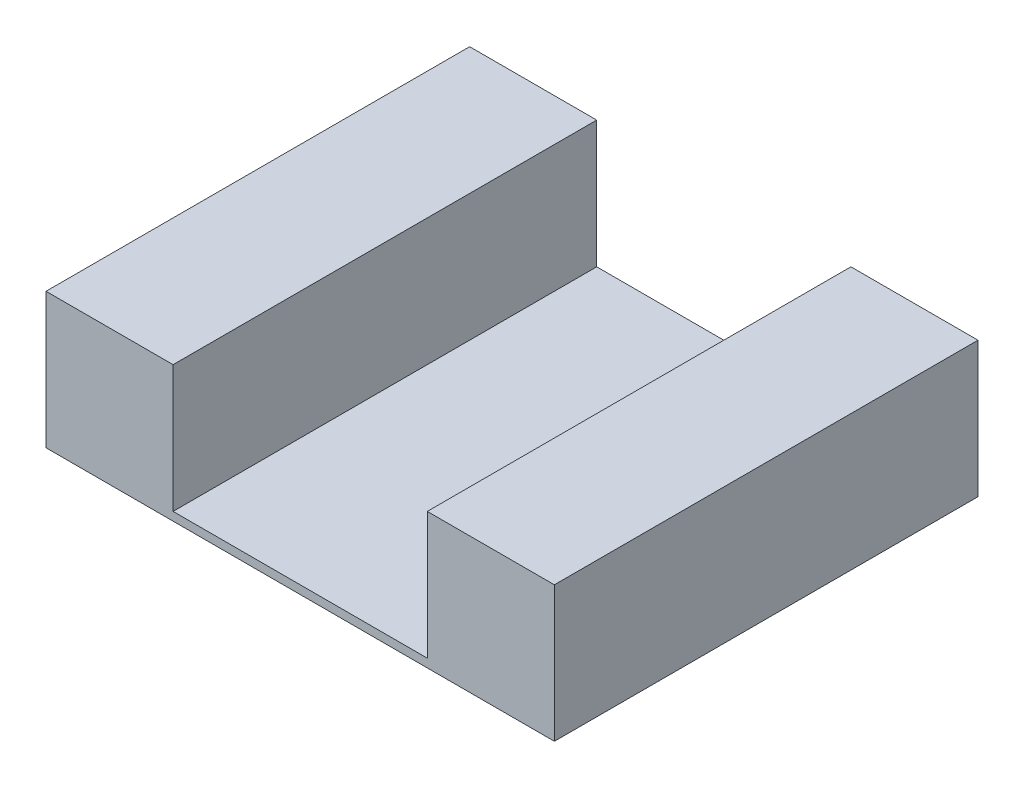
ISO-10303-21;
HEADER;
FILE_DESCRIPTION(('STEP AP214'),'2;1');
FILE_NAME('part.step','',(''),(''),'','','');
FILE_SCHEMA(('AUTOMOTIVE_DESIGN { 1 0 10303 214 1 1 1 1 }'));
ENDSEC;
DATA;
#1=APPLICATION_CONTEXT('core data for automotive mechanical design processes');
#2=APPLICATION_PROTOCOL_DEFINITION('international standard','automotive_design',2000,#1);
#3=PRODUCT_CONTEXT('',#1,'mechanical');
#4=PRODUCT('Part','Part','',(#3));
#5=PRODUCT_RELATED_PRODUCT_CATEGORY('part','',(#4));
#6=PRODUCT_DEFINITION_FORMATION('','',#4);
#7=PRODUCT_DEFINITION_CONTEXT('part definition',#1,'design');
#8=PRODUCT_DEFINITION('design','',#6,#7);
#9=PRODUCT_DEFINITION_SHAPE('','',#8);
#10=(LENGTH_UNIT() NAMED_UNIT(*) SI_UNIT(.MILLI.,.METRE.));
#11=(NAMED_UNIT(*) PLANE_ANGLE_UNIT() SI_UNIT($,.RADIAN.));
#12=(NAMED_UNIT(*) SI_UNIT($,.STERADIAN.) SOLID_ANGLE_UNIT());
#13=UNCERTAINTY_MEASURE_WITH_UNIT(LENGTH_MEASURE(1.E-05),#10,'distance_accuracy_value','');
#14=(GEOMETRIC_REPRESENTATION_CONTEXT(3) GLOBAL_UNCERTAINTY_ASSIGNED_CONTEXT((#13)) GLOBAL_UNIT_ASSIGNED_CONTEXT((#10,
#11,#12)) REPRESENTATION_CONTEXT('',''));
#15=CARTESIAN_POINT('',(0.,0.,0.));
#16=DIRECTION('',(0.,0.,1.));
#17=DIRECTION('',(1.,0.,0.));
#18=AXIS2_PLACEMENT_3D('',#15,#16,#17);
#19=CARTESIAN_POINT('',(600.,0.,500.));
#20=DIRECTION('',(0.,1.,0.));
#21=DIRECTION('',(-1.,0.,0.));
#22=AXIS2_PLACEMENT_3D('',#19,#20,#21);
#23=PLANE('',#22);
#24=DIRECTION('',(1.,0.,0.));
#25=VECTOR('',#24,1.);
#26=CARTESIAN_POINT('',(600.,0.,0.));
#27=LINE('',#26,#25);
#28=CARTESIAN_POINT('',(0.,0.,0.));
#29=VERTEX_POINT('',#28);
#30=CARTESIAN_POINT('',(600.,0.,0.));
#31=VERTEX_POINT('',#30);
#32=EDGE_CURVE('E141',#29,#31,#27,.T.);
#33=ORIENTED_EDGE('',*,*,#32,.T.);
#34=DIRECTION('',(0.,0.,-1.));
#35=VECTOR('',#34,1.);
#36=CARTESIAN_POINT('',(600.,0.,500.));
#37=LINE('',#36,#35);
#38=CARTESIAN_POINT('',(600.,0.,500.));
#39=VERTEX_POINT('',#38);
#40=EDGE_CURVE('E11',#39,#31,#37,.T.);
#41=ORIENTED_EDGE('',*,*,#40,.F.);
#42=DIRECTION('',(1.,0.,0.));
#43=VECTOR('',#42,1.);
#44=CARTESIAN_POINT('',(600.,0.,500.));
#45=LINE('',#44,#43);
#46=CARTESIAN_POINT('',(0.,0.,500.));
#47=VERTEX_POINT('',#46);
#48=EDGE_CURVE('E155',#47,#39,#45,.T.);
#49=ORIENTED_EDGE('',*,*,#48,.F.);
#50=DIRECTION('',(0.,0.,-1.));
#51=VECTOR('',#50,1.);
#52=CARTESIAN_POINT('',(0.,0.,500.));
#53=LINE('',#52,#51);
#54=EDGE_CURVE('E137',#47,#29,#53,.T.);
#55=ORIENTED_EDGE('',*,*,#54,.T.);
#56=EDGE_LOOP('',(#33,#41,#49,#55));
#57=FACE_BOUND('',#56,.T.);
#58=ADVANCED_FACE('F45',(#57),#23,.F.);
#59=CARTESIAN_POINT('',(600.,160.000000000001,500.));
#60=DIRECTION('',(-1.,0.,0.));
#61=DIRECTION('',(0.,0.,1.));
#62=AXIS2_PLACEMENT_3D('',#59,#60,#61);
#63=PLANE('',#62);
#64=DIRECTION('',(0.,1.,0.));
#65=VECTOR('',#64,1.);
#66=CARTESIAN_POINT('',(600.,160.000000000001,0.));
#67=LINE('',#66,#65);
#68=CARTESIAN_POINT('',(600.,160.000000000001,0.));
#69=VERTEX_POINT('',#68);
#70=EDGE_CURVE('E144',#31,#69,#67,.T.);
#71=ORIENTED_EDGE('',*,*,#70,.T.);
#72=DIRECTION('',(0.,0.,-1.));
#73=VECTOR('',#72,1.);
#74=CARTESIAN_POINT('',(600.,160.000000000001,500.));
#75=LINE('',#74,#73);
#76=CARTESIAN_POINT('',(600.,160.000000000001,500.));
#77=VERTEX_POINT('',#76);
#78=EDGE_CURVE('E53',#77,#69,#75,.T.);
#79=ORIENTED_EDGE('',*,*,#78,.F.);
#80=DIRECTION('',(0.,1.,0.));
#81=VECTOR('',#80,1.);
#82=CARTESIAN_POINT('',(600.,160.000000000001,500.));
#83=LINE('',#82,#81);
#84=EDGE_CURVE('E104',#39,#77,#83,.T.);
#85=ORIENTED_EDGE('',*,*,#84,.F.);
#86=ORIENTED_EDGE('',*,*,#40,.T.);
#87=EDGE_LOOP('',(#71,#79,#85,#86));
#88=FACE_BOUND('',#87,.T.);
#89=ADVANCED_FACE('F190',(#88),#63,.F.);
#90=CARTESIAN_POINT('',(450.,160.000000000001,500.));
#91=DIRECTION('',(0.,-1.,0.));
#92=DIRECTION('',(0.,0.,-1.));
#93=AXIS2_PLACEMENT_3D('',#90,#91,#92);
#94=PLANE('',#93);
#95=DIRECTION('',(-1.,0.,0.));
#96=VECTOR('',#95,1.);
#97=CARTESIAN_POINT('',(450.,160.000000000001,0.));
#98=LINE('',#97,#96);
#99=CARTESIAN_POINT('',(450.,160.000000000001,0.));
#100=VERTEX_POINT('',#99);
#101=EDGE_CURVE('E146',#69,#100,#98,.T.);
#102=ORIENTED_EDGE('',*,*,#101,.T.);
#103=DIRECTION('',(0.,0.,-1.));
#104=VECTOR('',#103,1.);
#105=CARTESIAN_POINT('',(450.,160.000000000001,500.));
#106=LINE('',#105,#104);
#107=CARTESIAN_POINT('',(450.,160.000000000001,500.));
#108=VERTEX_POINT('',#107);
#109=EDGE_CURVE('E162',#108,#100,#106,.T.);
#110=ORIENTED_EDGE('',*,*,#109,.F.);
#111=DIRECTION('',(-1.,0.,0.));
#112=VECTOR('',#111,1.);
#113=CARTESIAN_POINT('',(450.,160.000000000001,500.));
#114=LINE('',#113,#112);
#115=EDGE_CURVE('E170',#77,#108,#114,.T.);
#116=ORIENTED_EDGE('',*,*,#115,.F.);
#117=ORIENTED_EDGE('',*,*,#78,.T.);
#118=EDGE_LOOP('',(#102,#110,#116,#117));
#119=FACE_BOUND('',#118,.T.);
#120=ADVANCED_FACE('F168',(#119),#94,.F.);
#121=CARTESIAN_POINT('',(450.,10.0000000000001,500.));
#122=DIRECTION('',(1.,0.,0.));
#123=DIRECTION('',(0.,0.,-1.));
#124=AXIS2_PLACEMENT_3D('',#121,#122,#123);
#125=PLANE('',#124);
#126=DIRECTION('',(0.,-1.,0.));
#127=VECTOR('',#126,1.);
#128=CARTESIAN_POINT('',(450.,10.0000000000001,0.));
#129=LINE('',#128,#127);
#130=CARTESIAN_POINT('',(450.,10.0000000000001,0.));
#131=VERTEX_POINT('',#130);
#132=EDGE_CURVE('E148',#100,#131,#129,.T.);
#133=ORIENTED_EDGE('',*,*,#132,.T.);
#134=DIRECTION('',(0.,0.,-1.));
#135=VECTOR('',#134,1.);
#136=CARTESIAN_POINT('',(450.,10.0000000000001,500.));
#137=LINE('',#136,#135);
#138=CARTESIAN_POINT('',(450.,10.0000000000001,500.));
#139=VERTEX_POINT('',#138);
#140=EDGE_CURVE('E159',#139,#131,#137,.T.);
#141=ORIENTED_EDGE('',*,*,#140,.F.);
#142=DIRECTION('',(0.,-1.,0.));
#143=VECTOR('',#142,1.);
#144=CARTESIAN_POINT('',(450.,10.0000000000001,500.));
#145=LINE('',#144,#143);
#146=EDGE_CURVE('E182',#108,#139,#145,.T.);
#147=ORIENTED_EDGE('',*,*,#146,.F.);
#148=ORIENTED_EDGE('',*,*,#109,.T.);
#149=EDGE_LOOP('',(#133,#141,#147,#148));
#150=FACE_BOUND('',#149,.T.);
#151=ADVANCED_FACE('F178',(#150),#125,.F.);
#152=CARTESIAN_POINT('',(150.,10.0000000000001,500.));
#153=DIRECTION('',(0.,-1.,0.));
#154=DIRECTION('',(0.,0.,-1.));
#155=AXIS2_PLACEMENT_3D('',#152,#153,#154);
#156=PLANE('',#155);
#157=DIRECTION('',(-1.,0.,0.));
#158=VECTOR('',#157,1.);
#159=CARTESIAN_POINT('',(150.,10.0000000000001,0.));
#160=LINE('',#159,#158);
#161=CARTESIAN_POINT('',(150.,10.0000000000001,0.));
#162=VERTEX_POINT('',#161);
#163=EDGE_CURVE('E150',#131,#162,#160,.T.);
#164=ORIENTED_EDGE('',*,*,#163,.T.);
#165=DIRECTION('',(0.,0.,-1.));
#166=VECTOR('',#165,1.);
#167=CARTESIAN_POINT('',(150.,10.0000000000001,500.));
#168=LINE('',#167,#166);
#169=CARTESIAN_POINT('',(150.,10.0000000000001,500.));
#170=VERTEX_POINT('',#169);
#171=EDGE_CURVE('E132',#170,#162,#168,.T.);
#172=ORIENTED_EDGE('',*,*,#171,.F.);
#173=DIRECTION('',(-1.,0.,0.));
#174=VECTOR('',#173,1.);
#175=CARTESIAN_POINT('',(150.,10.0000000000001,500.));
#176=LINE('',#175,#174);
#177=EDGE_CURVE('E123',#139,#170,#176,.T.);
#178=ORIENTED_EDGE('',*,*,#177,.F.);
#179=ORIENTED_EDGE('',*,*,#140,.T.);
#180=EDGE_LOOP('',(#164,#172,#178,#179));
#181=FACE_BOUND('',#180,.T.);
#182=ADVANCED_FACE('F181',(#181),#156,.F.);
#183=CARTESIAN_POINT('',(150.,160.000000000001,500.));
#184=DIRECTION('',(-1.,0.,0.));
#185=DIRECTION('',(0.,-1.,0.));
#186=AXIS2_PLACEMENT_3D('',#183,#184,#185);
#187=PLANE('',#186);
#188=DIRECTION('',(0.,1.,0.));
#189=VECTOR('',#188,1.);
#190=CARTESIAN_POINT('',(150.,160.000000000001,0.));
#191=LINE('',#190,#189);
#192=CARTESIAN_POINT('',(150.,160.000000000001,0.));
#193=VERTEX_POINT('',#192);
#194=EDGE_CURVE('E131',#162,#193,#191,.T.);
#195=ORIENTED_EDGE('',*,*,#194,.T.);
#196=DIRECTION('',(0.,0.,-1.));
#197=VECTOR('',#196,1.);
#198=CARTESIAN_POINT('',(150.,160.000000000001,500.));
#199=LINE('',#198,#197);
#200=CARTESIAN_POINT('',(150.,160.000000000001,500.));
#201=VERTEX_POINT('',#200);
#202=EDGE_CURVE('E128',#201,#193,#199,.T.);
#203=ORIENTED_EDGE('',*,*,#202,.F.);
#204=DIRECTION('',(0.,1.,0.));
#205=VECTOR('',#204,1.);
#206=CARTESIAN_POINT('',(150.,160.000000000001,500.));
#207=LINE('',#206,#205);
#208=EDGE_CURVE('E117',#170,#201,#207,.T.);
#209=ORIENTED_EDGE('',*,*,#208,.F.);
#210=ORIENTED_EDGE('',*,*,#171,.T.);
#211=EDGE_LOOP('',(#195,#203,#209,#210));
#212=FACE_BOUND('',#211,.T.);
#213=ADVANCED_FACE('F129',(#212),#187,.F.);
#214=CARTESIAN_POINT('',(0.,160.000000000001,500.));
#215=DIRECTION('',(0.,-1.,0.));
#216=DIRECTION('',(0.,0.,-1.));
#217=AXIS2_PLACEMENT_3D('',#214,#215,#216);
#218=PLANE('',#217);
#219=DIRECTION('',(-1.,0.,0.));
#220=VECTOR('',#219,1.);
#221=CARTESIAN_POINT('',(0.,160.000000000001,0.));
#222=LINE('',#221,#220);
#223=CARTESIAN_POINT('',(0.,160.000000000001,0.));
#224=VERTEX_POINT('',#223);
#225=EDGE_CURVE('E90',#193,#224,#222,.T.);
#226=ORIENTED_EDGE('',*,*,#225,.T.);
#227=DIRECTION('',(0.,0.,-1.));
#228=VECTOR('',#227,1.);
#229=CARTESIAN_POINT('',(0.,160.000000000001,500.));
#230=LINE('',#229,#228);
#231=CARTESIAN_POINT('',(0.,160.000000000001,500.));
#232=VERTEX_POINT('',#231);
#233=EDGE_CURVE('E133',#232,#224,#230,.T.);
#234=ORIENTED_EDGE('',*,*,#233,.F.);
#235=DIRECTION('',(-1.,0.,0.));
#236=VECTOR('',#235,1.);
#237=CARTESIAN_POINT('',(0.,160.000000000001,500.));
#238=LINE('',#237,#236);
#239=EDGE_CURVE('E121',#201,#232,#238,.T.);
#240=ORIENTED_EDGE('',*,*,#239,.F.);
#241=ORIENTED_EDGE('',*,*,#202,.T.);
#242=EDGE_LOOP('',(#226,#234,#240,#241));
#243=FACE_BOUND('',#242,.T.);
#244=ADVANCED_FACE('F135',(#243),#218,.F.);
#245=CARTESIAN_POINT('',(0.,0.,500.));
#246=DIRECTION('',(1.,0.,0.));
#247=DIRECTION('',(0.,1.,0.));
#248=AXIS2_PLACEMENT_3D('',#245,#246,#247);
#249=PLANE('',#248);
#250=DIRECTION('',(0.,-1.,0.));
#251=VECTOR('',#250,1.);
#252=CARTESIAN_POINT('',(0.,0.,0.));
#253=LINE('',#252,#251);
#254=EDGE_CURVE('E96',#224,#29,#253,.T.);
#255=ORIENTED_EDGE('',*,*,#254,.T.);
#256=ORIENTED_EDGE('',*,*,#54,.F.);
#257=DIRECTION('',(0.,-1.,0.));
#258=VECTOR('',#257,1.);
#259=CARTESIAN_POINT('',(0.,0.,500.));
#260=LINE('',#259,#258);
#261=EDGE_CURVE('E61',#232,#47,#260,.T.);
#262=ORIENTED_EDGE('',*,*,#261,.F.);
#263=ORIENTED_EDGE('',*,*,#233,.T.);
#264=EDGE_LOOP('',(#255,#256,#262,#263));
#265=FACE_BOUND('',#264,.T.);
#266=ADVANCED_FACE('F206',(#265),#249,.F.);
#267=CARTESIAN_POINT('',(0.,0.,500.));
#268=DIRECTION('',(0.,0.,-1.));
#269=DIRECTION('',(-1.,0.,0.));
#270=AXIS2_PLACEMENT_3D('',#267,#268,#269);
#271=PLANE('',#270);
#272=ORIENTED_EDGE('',*,*,#48,.T.);
#273=ORIENTED_EDGE('',*,*,#84,.T.);
#274=ORIENTED_EDGE('',*,*,#115,.T.);
#275=ORIENTED_EDGE('',*,*,#146,.T.);
#276=ORIENTED_EDGE('',*,*,#177,.T.);
#277=ORIENTED_EDGE('',*,*,#208,.T.);
#278=ORIENTED_EDGE('',*,*,#239,.T.);
#279=ORIENTED_EDGE('',*,*,#261,.T.);
#280=EDGE_LOOP('',(#272,#273,#274,#275,#276,#277,#278,#279));
#281=FACE_BOUND('',#280,.T.);
#282=ADVANCED_FACE('F119',(#281),#271,.F.);
#283=CARTESIAN_POINT('',(0.,0.,0.));
#284=DIRECTION('',(0.,0.,-1.));
#285=DIRECTION('',(-1.,0.,0.));
#286=AXIS2_PLACEMENT_3D('',#283,#284,#285);
#287=PLANE('',#286);
#288=ORIENTED_EDGE('',*,*,#32,.F.);
#289=ORIENTED_EDGE('',*,*,#254,.F.);
#290=ORIENTED_EDGE('',*,*,#225,.F.);
#291=ORIENTED_EDGE('',*,*,#194,.F.);
#292=ORIENTED_EDGE('',*,*,#163,.F.);
#293=ORIENTED_EDGE('',*,*,#132,.F.);
#294=ORIENTED_EDGE('',*,*,#101,.F.);
#295=ORIENTED_EDGE('',*,*,#70,.F.);
#296=EDGE_LOOP('',(#288,#289,#290,#291,#292,#293,#294,#295));
#297=FACE_BOUND('',#296,.T.);
#298=ADVANCED_FACE('F174',(#297),#287,.T.);
#299=CLOSED_SHELL('',(#58,#89,#120,#151,#182,#213,#244,#266,#282,#298));
#300=MANIFOLD_SOLID_BREP('B2',#299);
#301=ADVANCED_BREP_SHAPE_REPRESENTATION('',(#18,#300),#14);
#302=SHAPE_DEFINITION_REPRESENTATION(#9,#301);
ENDSEC;
END-ISO-10303-21;
